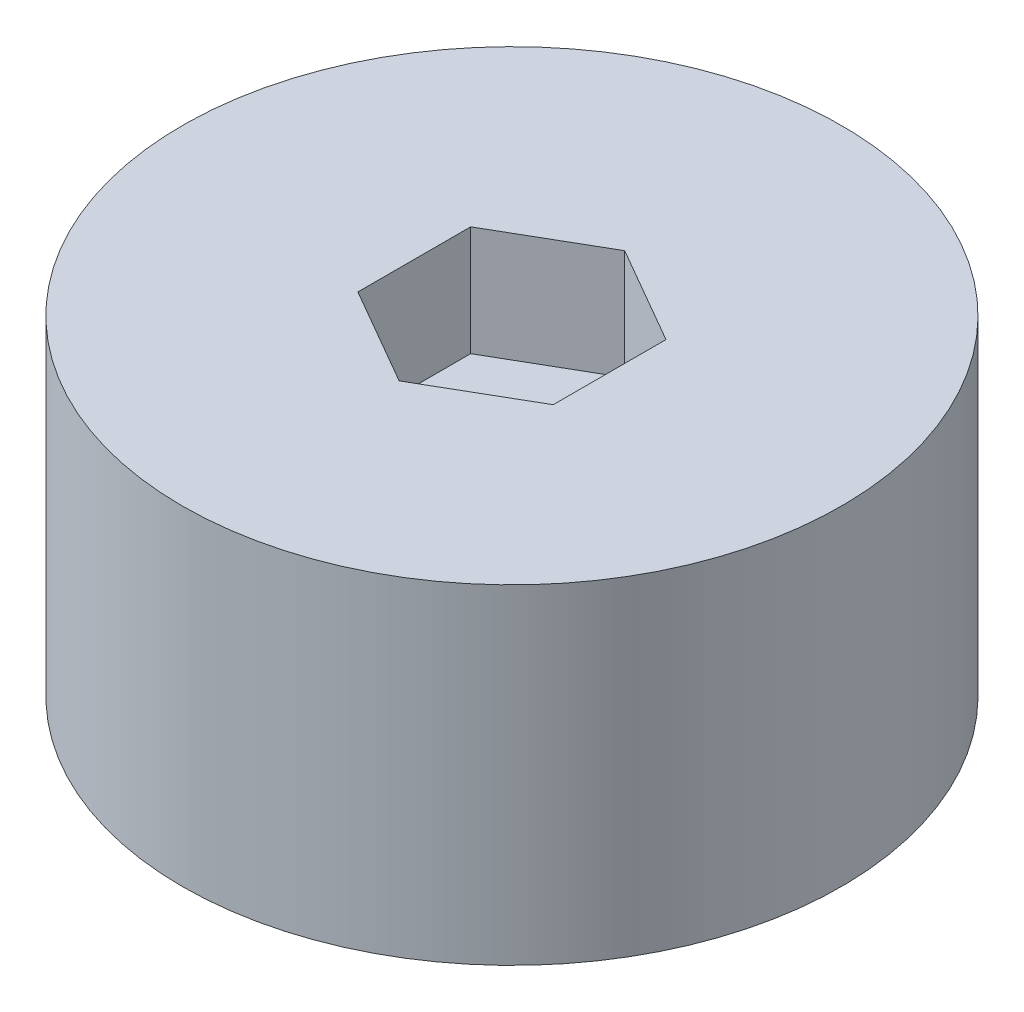
ISO-10303-21;
HEADER;
FILE_DESCRIPTION(('STEP AP214'),'2;1');
FILE_NAME('part.step','',(''),(''),'','','');
FILE_SCHEMA(('AUTOMOTIVE_DESIGN { 1 0 10303 214 1 1 1 1 }'));
ENDSEC;
DATA;
#1=APPLICATION_CONTEXT('core data for automotive mechanical design processes');
#2=APPLICATION_PROTOCOL_DEFINITION('international standard','automotive_design',2000,#1);
#3=PRODUCT_CONTEXT('',#1,'mechanical');
#4=PRODUCT('Part','Part','',(#3));
#5=PRODUCT_RELATED_PRODUCT_CATEGORY('part','',(#4));
#6=PRODUCT_DEFINITION_FORMATION('','',#4);
#7=PRODUCT_DEFINITION_CONTEXT('part definition',#1,'design');
#8=PRODUCT_DEFINITION('design','',#6,#7);
#9=PRODUCT_DEFINITION_SHAPE('','',#8);
#10=(LENGTH_UNIT() NAMED_UNIT(*) SI_UNIT(.MILLI.,.METRE.));
#11=(NAMED_UNIT(*) PLANE_ANGLE_UNIT() SI_UNIT($,.RADIAN.));
#12=(NAMED_UNIT(*) SI_UNIT($,.STERADIAN.) SOLID_ANGLE_UNIT());
#13=UNCERTAINTY_MEASURE_WITH_UNIT(LENGTH_MEASURE(1.E-05),#10,'distance_accuracy_value','');
#14=(GEOMETRIC_REPRESENTATION_CONTEXT(3) GLOBAL_UNCERTAINTY_ASSIGNED_CONTEXT((#13)) GLOBAL_UNIT_ASSIGNED_CONTEXT((#10,
#11,#12)) REPRESENTATION_CONTEXT('',''));
#15=CARTESIAN_POINT('',(0.,0.,0.));
#16=DIRECTION('',(0.,0.,1.));
#17=DIRECTION('',(1.,0.,0.));
#18=AXIS2_PLACEMENT_3D('',#15,#16,#17);
#19=CARTESIAN_POINT('',(0.,15.,0.));
#20=DIRECTION('',(0.,-1.,0.));
#21=DIRECTION('',(0.,0.,-1.));
#22=AXIS2_PLACEMENT_3D('',#19,#20,#21);
#23=CYLINDRICAL_SURFACE('',#22,15.);
#24=CARTESIAN_POINT('',(0.,15.,0.));
#25=DIRECTION('',(0.,1.,0.));
#26=DIRECTION('',(0.,0.,1.));
#27=AXIS2_PLACEMENT_3D('',#24,#25,#26);
#28=CIRCLE('',#27,15.);
#29=CARTESIAN_POINT('',(0.,15.,15.));
#30=VERTEX_POINT('',#29);
#31=EDGE_CURVE('E11',#30,#30,#28,.T.);
#32=ORIENTED_EDGE('',*,*,#31,.F.);
#33=EDGE_LOOP('',(#32));
#34=FACE_BOUND('',#33,.T.);
#35=CARTESIAN_POINT('',(0.,0.,0.));
#36=DIRECTION('',(0.,1.,0.));
#37=DIRECTION('',(0.,0.,1.));
#38=AXIS2_PLACEMENT_3D('',#35,#36,#37);
#39=CIRCLE('',#38,15.);
#40=CARTESIAN_POINT('',(0.,0.,15.));
#41=VERTEX_POINT('',#40);
#42=EDGE_CURVE('E39',#41,#41,#39,.T.);
#43=ORIENTED_EDGE('',*,*,#42,.T.);
#44=EDGE_LOOP('',(#43));
#45=FACE_BOUND('',#44,.T.);
#46=ADVANCED_FACE('F36',(#34,#45),#23,.T.);
#47=CARTESIAN_POINT('',(0.,15.,0.));
#48=DIRECTION('',(0.,1.,0.));
#49=DIRECTION('',(0.,0.,1.));
#50=AXIS2_PLACEMENT_3D('',#47,#48,#49);
#51=PLANE('',#50);
#52=DIRECTION('',(-0.866025403784439,0.,-0.5));
#53=VECTOR('',#52,1.);
#54=CARTESIAN_POINT('',(4.44499999999999,15.,-2.56632194654789));
#55=LINE('',#54,#53);
#56=CARTESIAN_POINT('',(4.44499999999999,15.,-2.56632194654789));
#57=VERTEX_POINT('',#56);
#58=CARTESIAN_POINT('',(0.,15.,-5.13264389309577));
#59=VERTEX_POINT('',#58);
#60=EDGE_CURVE('E50',#57,#59,#55,.T.);
#61=ORIENTED_EDGE('',*,*,#60,.F.);
#62=DIRECTION('',(0.,0.,-1.));
#63=VECTOR('',#62,1.);
#64=CARTESIAN_POINT('',(4.44499999999999,15.,2.56632194654789));
#65=LINE('',#64,#63);
#66=CARTESIAN_POINT('',(4.44499999999999,15.,2.56632194654789));
#67=VERTEX_POINT('',#66);
#68=EDGE_CURVE('E133',#67,#57,#65,.T.);
#69=ORIENTED_EDGE('',*,*,#68,.F.);
#70=DIRECTION('',(0.866025403784438,0.,-0.5));
#71=VECTOR('',#70,1.);
#72=CARTESIAN_POINT('',(0.,15.,5.13264389309577));
#73=LINE('',#72,#71);
#74=CARTESIAN_POINT('',(0.,15.,5.13264389309577));
#75=VERTEX_POINT('',#74);
#76=EDGE_CURVE('E131',#75,#67,#73,.T.);
#77=ORIENTED_EDGE('',*,*,#76,.F.);
#78=DIRECTION('',(0.866025403784439,0.,0.5));
#79=VECTOR('',#78,1.);
#80=CARTESIAN_POINT('',(-4.44500000000001,15.,2.56632194654789));
#81=LINE('',#80,#79);
#82=CARTESIAN_POINT('',(-4.44500000000001,15.,2.56632194654789));
#83=VERTEX_POINT('',#82);
#84=EDGE_CURVE('E98',#83,#75,#81,.T.);
#85=ORIENTED_EDGE('',*,*,#84,.F.);
#86=DIRECTION('',(0.,0.,1.));
#87=VECTOR('',#86,1.);
#88=CARTESIAN_POINT('',(-4.44500000000001,15.,-2.56632194654788));
#89=LINE('',#88,#87);
#90=CARTESIAN_POINT('',(-4.44500000000001,15.,-2.56632194654788));
#91=VERTEX_POINT('',#90);
#92=EDGE_CURVE('E127',#91,#83,#89,.T.);
#93=ORIENTED_EDGE('',*,*,#92,.F.);
#94=DIRECTION('',(-0.866025403784438,0.,0.500000000000001));
#95=VECTOR('',#94,1.);
#96=CARTESIAN_POINT('',(0.,15.,-5.13264389309577));
#97=LINE('',#96,#95);
#98=EDGE_CURVE('E124',#59,#91,#97,.T.);
#99=ORIENTED_EDGE('',*,*,#98,.F.);
#100=EDGE_LOOP('',(#61,#69,#77,#85,#93,#99));
#101=FACE_BOUND('',#100,.T.);
#102=ORIENTED_EDGE('',*,*,#31,.T.);
#103=EDGE_LOOP('',(#102));
#104=FACE_BOUND('',#103,.T.);
#105=ADVANCED_FACE('F154',(#101,#104),#51,.T.);
#106=CARTESIAN_POINT('',(0.,0.,0.));
#107=DIRECTION('',(0.,1.,0.));
#108=DIRECTION('',(0.,0.,1.));
#109=AXIS2_PLACEMENT_3D('',#106,#107,#108);
#110=PLANE('',#109);
#111=CARTESIAN_POINT('',(0.,0.,0.));
#112=DIRECTION('',(0.,-1.,0.));
#113=DIRECTION('',(0.,0.,-1.));
#114=AXIS2_PLACEMENT_3D('',#111,#112,#113);
#115=CIRCLE('',#114,10.48);
#116=CARTESIAN_POINT('',(0.,0.,-10.48));
#117=VERTEX_POINT('',#116);
#118=EDGE_CURVE('E137',#117,#117,#115,.T.);
#119=ORIENTED_EDGE('',*,*,#118,.F.);
#120=EDGE_LOOP('',(#119));
#121=FACE_BOUND('',#120,.T.);
#122=ORIENTED_EDGE('',*,*,#42,.F.);
#123=EDGE_LOOP('',(#122));
#124=FACE_BOUND('',#123,.T.);
#125=ADVANCED_FACE('F151',(#121,#124),#110,.F.);
#126=CARTESIAN_POINT('',(0.,4.,0.));
#127=DIRECTION('',(0.,-1.,0.));
#128=DIRECTION('',(0.,0.,-1.));
#129=AXIS2_PLACEMENT_3D('',#126,#127,#128);
#130=CYLINDRICAL_SURFACE('',#129,10.48);
#131=CARTESIAN_POINT('',(0.,4.,0.));
#132=DIRECTION('',(0.,-1.,0.));
#133=DIRECTION('',(0.,0.,-1.));
#134=AXIS2_PLACEMENT_3D('',#131,#132,#133);
#135=CIRCLE('',#134,10.48);
#136=CARTESIAN_POINT('',(0.,4.,-10.48));
#137=VERTEX_POINT('',#136);
#138=EDGE_CURVE('E143',#137,#137,#135,.T.);
#139=ORIENTED_EDGE('',*,*,#138,.F.);
#140=EDGE_LOOP('',(#139));
#141=FACE_BOUND('',#140,.T.);
#142=ORIENTED_EDGE('',*,*,#118,.T.);
#143=EDGE_LOOP('',(#142));
#144=FACE_BOUND('',#143,.T.);
#145=ADVANCED_FACE('F149',(#141,#144),#130,.F.);
#146=CARTESIAN_POINT('',(0.,4.,0.));
#147=DIRECTION('',(0.,-1.,0.));
#148=DIRECTION('',(0.,0.,-1.));
#149=AXIS2_PLACEMENT_3D('',#146,#147,#148);
#150=PLANE('',#149);
#151=ORIENTED_EDGE('',*,*,#138,.T.);
#152=EDGE_LOOP('',(#151));
#153=FACE_BOUND('',#152,.T.);
#154=ADVANCED_FACE('F172',(#153),#150,.T.);
#155=CARTESIAN_POINT('',(4.44499999999999,10.,-2.56632194654789));
#156=DIRECTION('',(0.5,0.,-0.866025403784439));
#157=DIRECTION('',(-0.866025403784439,0.,-0.5));
#158=AXIS2_PLACEMENT_3D('',#155,#156,#157);
#159=PLANE('',#158);
#160=ORIENTED_EDGE('',*,*,#60,.T.);
#161=DIRECTION('',(0.,1.,0.));
#162=VECTOR('',#161,1.);
#163=CARTESIAN_POINT('',(0.,10.,-5.13264389309577));
#164=LINE('',#163,#162);
#165=CARTESIAN_POINT('',(0.,10.,-5.13264389309577));
#166=VERTEX_POINT('',#165);
#167=EDGE_CURVE('E80',#166,#59,#164,.T.);
#168=ORIENTED_EDGE('',*,*,#167,.F.);
#169=DIRECTION('',(-0.866025403784439,0.,-0.5));
#170=VECTOR('',#169,1.);
#171=CARTESIAN_POINT('',(4.44499999999999,10.,-2.56632194654789));
#172=LINE('',#171,#170);
#173=CARTESIAN_POINT('',(4.44499999999999,10.,-2.56632194654789));
#174=VERTEX_POINT('',#173);
#175=EDGE_CURVE('E135',#174,#166,#172,.T.);
#176=ORIENTED_EDGE('',*,*,#175,.F.);
#177=DIRECTION('',(0.,1.,0.));
#178=VECTOR('',#177,1.);
#179=CARTESIAN_POINT('',(4.44499999999999,10.,-2.56632194654789));
#180=LINE('',#179,#178);
#181=EDGE_CURVE('E58',#174,#57,#180,.T.);
#182=ORIENTED_EDGE('',*,*,#181,.T.);
#183=EDGE_LOOP('',(#160,#168,#176,#182));
#184=FACE_BOUND('',#183,.T.);
#185=ADVANCED_FACE('F176',(#184),#159,.F.);
#186=CARTESIAN_POINT('',(4.44499999999999,10.,2.56632194654789));
#187=DIRECTION('',(1.,0.,0.));
#188=DIRECTION('',(0.,0.,-1.));
#189=AXIS2_PLACEMENT_3D('',#186,#187,#188);
#190=PLANE('',#189);
#191=ORIENTED_EDGE('',*,*,#68,.T.);
#192=ORIENTED_EDGE('',*,*,#181,.F.);
#193=DIRECTION('',(0.,0.,-1.));
#194=VECTOR('',#193,1.);
#195=CARTESIAN_POINT('',(4.44499999999999,10.,2.56632194654789));
#196=LINE('',#195,#194);
#197=CARTESIAN_POINT('',(4.44499999999999,10.,2.56632194654789));
#198=VERTEX_POINT('',#197);
#199=EDGE_CURVE('E110',#198,#174,#196,.T.);
#200=ORIENTED_EDGE('',*,*,#199,.F.);
#201=DIRECTION('',(0.,1.,0.));
#202=VECTOR('',#201,1.);
#203=CARTESIAN_POINT('',(4.44499999999999,10.,2.56632194654789));
#204=LINE('',#203,#202);
#205=EDGE_CURVE('E102',#198,#67,#204,.T.);
#206=ORIENTED_EDGE('',*,*,#205,.T.);
#207=EDGE_LOOP('',(#191,#192,#200,#206));
#208=FACE_BOUND('',#207,.T.);
#209=ADVANCED_FACE('F180',(#208),#190,.F.);
#210=CARTESIAN_POINT('',(0.,10.,5.13264389309577));
#211=DIRECTION('',(0.5,0.,0.866025403784438));
#212=DIRECTION('',(0.866025403784438,0.,-0.5));
#213=AXIS2_PLACEMENT_3D('',#210,#211,#212);
#214=PLANE('',#213);
#215=ORIENTED_EDGE('',*,*,#76,.T.);
#216=ORIENTED_EDGE('',*,*,#205,.F.);
#217=DIRECTION('',(0.866025403784438,0.,-0.5));
#218=VECTOR('',#217,1.);
#219=CARTESIAN_POINT('',(0.,10.,5.13264389309577));
#220=LINE('',#219,#218);
#221=CARTESIAN_POINT('',(0.,10.,5.13264389309577));
#222=VERTEX_POINT('',#221);
#223=EDGE_CURVE('E106',#222,#198,#220,.T.);
#224=ORIENTED_EDGE('',*,*,#223,.F.);
#225=DIRECTION('',(0.,1.,0.));
#226=VECTOR('',#225,1.);
#227=CARTESIAN_POINT('',(0.,10.,5.13264389309577));
#228=LINE('',#227,#226);
#229=EDGE_CURVE('E91',#222,#75,#228,.T.);
#230=ORIENTED_EDGE('',*,*,#229,.T.);
#231=EDGE_LOOP('',(#215,#216,#224,#230));
#232=FACE_BOUND('',#231,.T.);
#233=ADVANCED_FACE('F107',(#232),#214,.F.);
#234=CARTESIAN_POINT('',(-4.44500000000001,10.,2.56632194654789));
#235=DIRECTION('',(-0.5,0.,0.866025403784439));
#236=DIRECTION('',(0.866025403784439,0.,0.5));
#237=AXIS2_PLACEMENT_3D('',#234,#235,#236);
#238=PLANE('',#237);
#239=ORIENTED_EDGE('',*,*,#84,.T.);
#240=ORIENTED_EDGE('',*,*,#229,.F.);
#241=DIRECTION('',(0.866025403784439,0.,0.5));
#242=VECTOR('',#241,1.);
#243=CARTESIAN_POINT('',(-4.44500000000001,10.,2.56632194654789));
#244=LINE('',#243,#242);
#245=CARTESIAN_POINT('',(-4.44500000000001,10.,2.56632194654789));
#246=VERTEX_POINT('',#245);
#247=EDGE_CURVE('E95',#246,#222,#244,.T.);
#248=ORIENTED_EDGE('',*,*,#247,.F.);
#249=DIRECTION('',(0.,1.,0.));
#250=VECTOR('',#249,1.);
#251=CARTESIAN_POINT('',(-4.44500000000001,10.,2.56632194654789));
#252=LINE('',#251,#250);
#253=EDGE_CURVE('E103',#246,#83,#252,.T.);
#254=ORIENTED_EDGE('',*,*,#253,.T.);
#255=EDGE_LOOP('',(#239,#240,#248,#254));
#256=FACE_BOUND('',#255,.T.);
#257=ADVANCED_FACE('F93',(#256),#238,.F.);
#258=CARTESIAN_POINT('',(-4.44500000000001,10.,-2.56632194654788));
#259=DIRECTION('',(-1.,0.,0.));
#260=DIRECTION('',(0.,0.,1.));
#261=AXIS2_PLACEMENT_3D('',#258,#259,#260);
#262=PLANE('',#261);
#263=ORIENTED_EDGE('',*,*,#92,.T.);
#264=ORIENTED_EDGE('',*,*,#253,.F.);
#265=DIRECTION('',(0.,0.,1.));
#266=VECTOR('',#265,1.);
#267=CARTESIAN_POINT('',(-4.44500000000001,10.,-2.56632194654788));
#268=LINE('',#267,#266);
#269=CARTESIAN_POINT('',(-4.44500000000001,10.,-2.56632194654788));
#270=VERTEX_POINT('',#269);
#271=EDGE_CURVE('E116',#270,#246,#268,.T.);
#272=ORIENTED_EDGE('',*,*,#271,.F.);
#273=DIRECTION('',(0.,1.,0.));
#274=VECTOR('',#273,1.);
#275=CARTESIAN_POINT('',(-4.44500000000001,10.,-2.56632194654788));
#276=LINE('',#275,#274);
#277=EDGE_CURVE('E140',#270,#91,#276,.T.);
#278=ORIENTED_EDGE('',*,*,#277,.T.);
#279=EDGE_LOOP('',(#263,#264,#272,#278));
#280=FACE_BOUND('',#279,.T.);
#281=ADVANCED_FACE('F184',(#280),#262,.F.);
#282=CARTESIAN_POINT('',(0.,10.,-5.13264389309577));
#283=DIRECTION('',(-0.500000000000001,0.,-0.866025403784438));
#284=DIRECTION('',(-0.866025403784438,0.,0.500000000000001));
#285=AXIS2_PLACEMENT_3D('',#282,#283,#284);
#286=PLANE('',#285);
#287=ORIENTED_EDGE('',*,*,#98,.T.);
#288=ORIENTED_EDGE('',*,*,#277,.F.);
#289=DIRECTION('',(-0.866025403784438,0.,0.500000000000001));
#290=VECTOR('',#289,1.);
#291=CARTESIAN_POINT('',(0.,10.,-5.13264389309577));
#292=LINE('',#291,#290);
#293=EDGE_CURVE('E118',#166,#270,#292,.T.);
#294=ORIENTED_EDGE('',*,*,#293,.F.);
#295=ORIENTED_EDGE('',*,*,#167,.T.);
#296=EDGE_LOOP('',(#287,#288,#294,#295));
#297=FACE_BOUND('',#296,.T.);
#298=ADVANCED_FACE('F181',(#297),#286,.F.);
#299=CARTESIAN_POINT('',(0.,10.,0.));
#300=DIRECTION('',(0.,1.,0.));
#301=DIRECTION('',(0.,0.,1.));
#302=AXIS2_PLACEMENT_3D('',#299,#300,#301);
#303=PLANE('',#302);
#304=ORIENTED_EDGE('',*,*,#175,.T.);
#305=ORIENTED_EDGE('',*,*,#293,.T.);
#306=ORIENTED_EDGE('',*,*,#271,.T.);
#307=ORIENTED_EDGE('',*,*,#247,.T.);
#308=ORIENTED_EDGE('',*,*,#223,.T.);
#309=ORIENTED_EDGE('',*,*,#199,.T.);
#310=EDGE_LOOP('',(#304,#305,#306,#307,#308,#309));
#311=FACE_BOUND('',#310,.T.);
#312=ADVANCED_FACE('F113',(#311),#303,.T.);
#313=CLOSED_SHELL('',(#46,#105,#125,#145,#154,#185,#209,#233,#257,#281,#298,#312));
#314=MANIFOLD_SOLID_BREP('B2',#313);
#315=ADVANCED_BREP_SHAPE_REPRESENTATION('',(#18,#314),#14);
#316=SHAPE_DEFINITION_REPRESENTATION(#9,#315);
ENDSEC;
END-ISO-10303-21;
